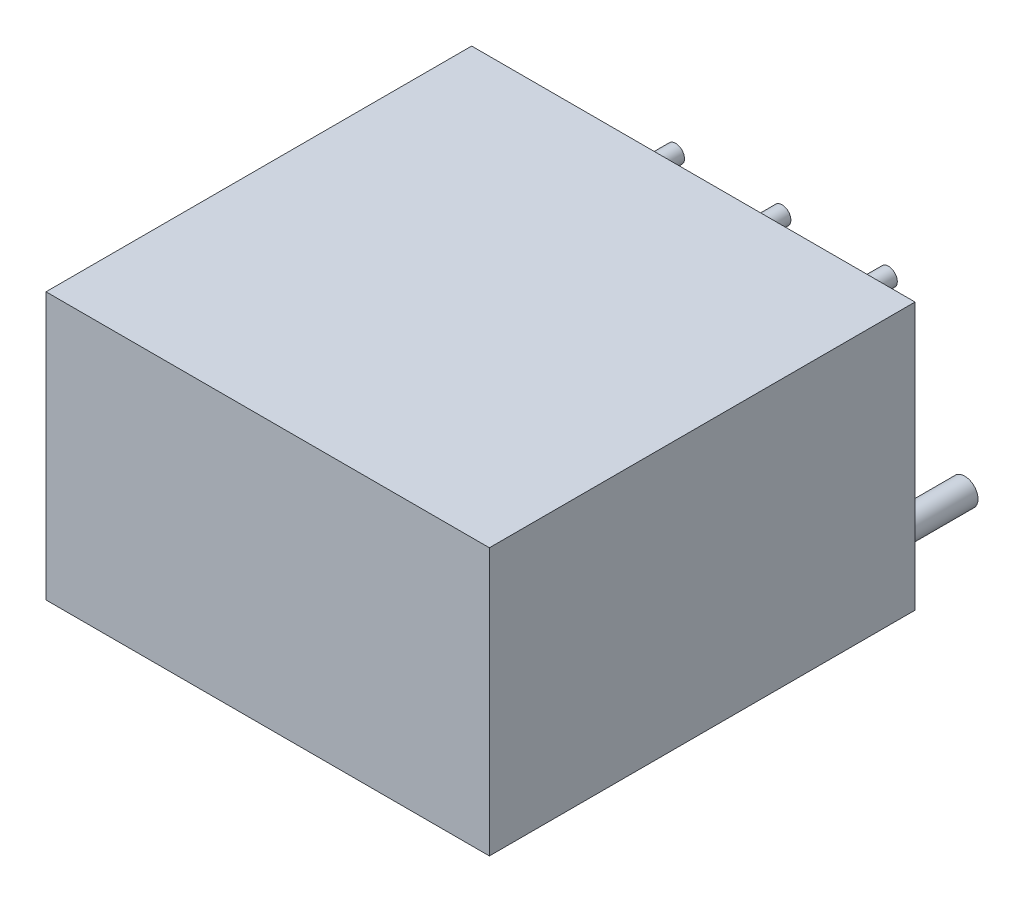
ISO-10303-21;
HEADER;
FILE_DESCRIPTION(('STEP AP214'),'2;1');
FILE_NAME('part.step','',(''),(''),'','','');
FILE_SCHEMA(('AUTOMOTIVE_DESIGN { 1 0 10303 214 1 1 1 1 }'));
ENDSEC;
DATA;
#1=APPLICATION_CONTEXT('core data for automotive mechanical design processes');
#2=APPLICATION_PROTOCOL_DEFINITION('international standard','automotive_design',2000,#1);
#3=PRODUCT_CONTEXT('',#1,'mechanical');
#4=PRODUCT('Part','Part','',(#3));
#5=PRODUCT_RELATED_PRODUCT_CATEGORY('part','',(#4));
#6=PRODUCT_DEFINITION_FORMATION('','',#4);
#7=PRODUCT_DEFINITION_CONTEXT('part definition',#1,'design');
#8=PRODUCT_DEFINITION('design','',#6,#7);
#9=PRODUCT_DEFINITION_SHAPE('','',#8);
#10=(LENGTH_UNIT() NAMED_UNIT(*) SI_UNIT(.MILLI.,.METRE.));
#11=(NAMED_UNIT(*) PLANE_ANGLE_UNIT() SI_UNIT($,.RADIAN.));
#12=(NAMED_UNIT(*) SI_UNIT($,.STERADIAN.) SOLID_ANGLE_UNIT());
#13=UNCERTAINTY_MEASURE_WITH_UNIT(LENGTH_MEASURE(1.E-05),#10,'distance_accuracy_value','');
#14=(GEOMETRIC_REPRESENTATION_CONTEXT(3) GLOBAL_UNCERTAINTY_ASSIGNED_CONTEXT((#13)) GLOBAL_UNIT_ASSIGNED_CONTEXT((#10,
#11,#12)) REPRESENTATION_CONTEXT('',''));
#15=CARTESIAN_POINT('',(0.,0.,0.));
#16=DIRECTION('',(0.,0.,1.));
#17=DIRECTION('',(1.,0.,0.));
#18=AXIS2_PLACEMENT_3D('',#15,#16,#17);
#19=CARTESIAN_POINT('',(-29.5791256800389,10.0182330252573,0.));
#20=DIRECTION('',(0.,0.,1.));
#21=DIRECTION('',(1.,0.,0.));
#22=AXIS2_PLACEMENT_3D('',#19,#20,#21);
#23=PLANE('',#22);
#24=CARTESIAN_POINT('',(-23.0791262800389,14.5682308652573,0.));
#25=DIRECTION('',(0.,0.,1.));
#26=DIRECTION('',(1.,0.,0.));
#27=AXIS2_PLACEMENT_3D('',#24,#25,#26);
#28=CIRCLE('',#27,0.499999999999999);
#29=CARTESIAN_POINT('',(-22.5791262800389,14.5682308652573,0.));
#30=VERTEX_POINT('',#29);
#31=EDGE_CURVE('E42',#30,#30,#28,.F.);
#32=ORIENTED_EDGE('',*,*,#31,.F.);
#33=EDGE_LOOP('',(#32));
#34=FACE_BOUND('',#33,.T.);
#35=CARTESIAN_POINT('',(-17.0791255800389,20.5682308652573,0.));
#36=DIRECTION('',(0.,0.,1.));
#37=DIRECTION('',(1.,0.,0.));
#38=AXIS2_PLACEMENT_3D('',#35,#36,#37);
#39=CIRCLE('',#38,0.499999999999999);
#40=CARTESIAN_POINT('',(-16.5791255800389,20.5682308652573,0.));
#41=VERTEX_POINT('',#40);
#42=EDGE_CURVE('E123',#41,#41,#39,.F.);
#43=ORIENTED_EDGE('',*,*,#42,.F.);
#44=EDGE_LOOP('',(#43));
#45=FACE_BOUND('',#44,.T.);
#46=CARTESIAN_POINT('',(-17.0791255800389,14.5682308652573,0.));
#47=DIRECTION('',(0.,0.,1.));
#48=DIRECTION('',(1.,0.,0.));
#49=AXIS2_PLACEMENT_3D('',#46,#47,#48);
#50=CIRCLE('',#49,0.499999999999999);
#51=CARTESIAN_POINT('',(-16.5791255800389,14.5682308652573,0.));
#52=VERTEX_POINT('',#51);
#53=EDGE_CURVE('E117',#52,#52,#50,.F.);
#54=ORIENTED_EDGE('',*,*,#53,.F.);
#55=EDGE_LOOP('',(#54));
#56=FACE_BOUND('',#55,.T.);
#57=CARTESIAN_POINT('',(-6.77912488003891,12.2182330252573,0.));
#58=DIRECTION('',(0.,0.,1.));
#59=DIRECTION('',(1.,0.,0.));
#60=AXIS2_PLACEMENT_3D('',#57,#58,#59);
#61=CIRCLE('',#60,0.75);
#62=CARTESIAN_POINT('',(-6.02912488003891,12.2182330252573,0.));
#63=VERTEX_POINT('',#62);
#64=EDGE_CURVE('E111',#63,#63,#61,.F.);
#65=ORIENTED_EDGE('',*,*,#64,.F.);
#66=EDGE_LOOP('',(#65));
#67=FACE_BOUND('',#66,.T.);
#68=DIRECTION('',(0.,-1.,0.));
#69=VECTOR('',#68,1.);
#70=CARTESIAN_POINT('',(-29.5791256800389,25.0682308652573,0.));
#71=LINE('',#70,#69);
#72=CARTESIAN_POINT('',(-29.5791256800389,25.0682308652573,0.));
#73=VERTEX_POINT('',#72);
#74=CARTESIAN_POINT('',(-29.5791256800389,10.0182330252573,0.));
#75=VERTEX_POINT('',#74);
#76=EDGE_CURVE('E101',#73,#75,#71,.T.);
#77=ORIENTED_EDGE('',*,*,#76,.F.);
#78=DIRECTION('',(-1.,0.,0.));
#79=VECTOR('',#78,1.);
#80=CARTESIAN_POINT('',(-29.5791256800389,25.0682308652573,0.));
#81=LINE('',#80,#79);
#82=CARTESIAN_POINT('',(-4.57912488003891,25.0682308652573,0.));
#83=VERTEX_POINT('',#82);
#84=EDGE_CURVE('E73',#83,#73,#81,.T.);
#85=ORIENTED_EDGE('',*,*,#84,.F.);
#86=DIRECTION('',(0.,1.,0.));
#87=VECTOR('',#86,1.);
#88=CARTESIAN_POINT('',(-4.57912488003891,25.0682308652573,0.));
#89=LINE('',#88,#87);
#90=CARTESIAN_POINT('',(-4.57912488003891,10.0182330252573,0.));
#91=VERTEX_POINT('',#90);
#92=EDGE_CURVE('E67',#91,#83,#89,.T.);
#93=ORIENTED_EDGE('',*,*,#92,.F.);
#94=DIRECTION('',(1.,0.,0.));
#95=VECTOR('',#94,1.);
#96=CARTESIAN_POINT('',(-29.5791256800389,10.0182330252573,0.));
#97=LINE('',#96,#95);
#98=EDGE_CURVE('E91',#75,#91,#97,.T.);
#99=ORIENTED_EDGE('',*,*,#98,.F.);
#100=EDGE_LOOP('',(#77,#85,#93,#99));
#101=FACE_BOUND('',#100,.T.);
#102=CARTESIAN_POINT('',(-11.0791248800389,14.5682308652573,0.));
#103=DIRECTION('',(0.,0.,1.));
#104=DIRECTION('',(1.,0.,0.));
#105=AXIS2_PLACEMENT_3D('',#102,#103,#104);
#106=CIRCLE('',#105,0.499999999999999);
#107=CARTESIAN_POINT('',(-10.5791248800389,14.5682308652573,0.));
#108=VERTEX_POINT('',#107);
#109=EDGE_CURVE('E114',#108,#108,#106,.F.);
#110=ORIENTED_EDGE('',*,*,#109,.F.);
#111=EDGE_LOOP('',(#110));
#112=FACE_BOUND('',#111,.T.);
#113=CARTESIAN_POINT('',(-11.0791248800389,20.5682308652573,0.));
#114=DIRECTION('',(0.,0.,1.));
#115=DIRECTION('',(1.,0.,0.));
#116=AXIS2_PLACEMENT_3D('',#113,#114,#115);
#117=CIRCLE('',#116,0.499999999999999);
#118=CARTESIAN_POINT('',(-10.5791248800389,20.5682308652573,0.));
#119=VERTEX_POINT('',#118);
#120=EDGE_CURVE('E120',#119,#119,#117,.F.);
#121=ORIENTED_EDGE('',*,*,#120,.F.);
#122=EDGE_LOOP('',(#121));
#123=FACE_BOUND('',#122,.T.);
#124=CARTESIAN_POINT('',(-23.0791262800389,20.5682308652573,0.));
#125=DIRECTION('',(0.,0.,1.));
#126=DIRECTION('',(1.,0.,0.));
#127=AXIS2_PLACEMENT_3D('',#124,#125,#126);
#128=CIRCLE('',#127,0.499999999999999);
#129=CARTESIAN_POINT('',(-22.5791262800389,20.5682308652573,0.));
#130=VERTEX_POINT('',#129);
#131=EDGE_CURVE('E126',#130,#130,#128,.F.);
#132=ORIENTED_EDGE('',*,*,#131,.F.);
#133=EDGE_LOOP('',(#132));
#134=FACE_BOUND('',#133,.T.);
#135=CARTESIAN_POINT('',(-27.3791256800389,12.2182330252573,0.));
#136=DIRECTION('',(0.,0.,1.));
#137=DIRECTION('',(1.,0.,0.));
#138=AXIS2_PLACEMENT_3D('',#135,#136,#137);
#139=CIRCLE('',#138,0.750000000000002);
#140=CARTESIAN_POINT('',(-26.6291256800389,12.2182330252573,0.));
#141=VERTEX_POINT('',#140);
#142=EDGE_CURVE('E11',#141,#141,#139,.F.);
#143=ORIENTED_EDGE('',*,*,#142,.F.);
#144=EDGE_LOOP('',(#143));
#145=FACE_BOUND('',#144,.T.);
#146=ADVANCED_FACE('F33',(#34,#45,#56,#67,#101,#112,#123,#134,#145),#23,.F.);
#147=CARTESIAN_POINT('',(-29.5791256800389,25.0682308652573,24.));
#148=DIRECTION('',(1.,0.,0.));
#149=DIRECTION('',(0.,0.,-1.));
#150=AXIS2_PLACEMENT_3D('',#147,#148,#149);
#151=PLANE('',#150);
#152=ORIENTED_EDGE('',*,*,#76,.T.);
#153=DIRECTION('',(0.,0.,-1.));
#154=VECTOR('',#153,1.);
#155=CARTESIAN_POINT('',(-29.5791256800389,10.0182330252573,24.));
#156=LINE('',#155,#154);
#157=CARTESIAN_POINT('',(-29.5791256800389,10.0182330252573,24.));
#158=VERTEX_POINT('',#157);
#159=EDGE_CURVE('E92',#158,#75,#156,.T.);
#160=ORIENTED_EDGE('',*,*,#159,.F.);
#161=DIRECTION('',(0.,-1.,0.));
#162=VECTOR('',#161,1.);
#163=CARTESIAN_POINT('',(-29.5791256800389,25.0682308652573,24.));
#164=LINE('',#163,#162);
#165=CARTESIAN_POINT('',(-29.5791256800389,25.0682308652573,24.));
#166=VERTEX_POINT('',#165);
#167=EDGE_CURVE('E86',#166,#158,#164,.T.);
#168=ORIENTED_EDGE('',*,*,#167,.F.);
#169=DIRECTION('',(0.,0.,-1.));
#170=VECTOR('',#169,1.);
#171=CARTESIAN_POINT('',(-29.5791256800389,25.0682308652573,24.));
#172=LINE('',#171,#170);
#173=EDGE_CURVE('E97',#166,#73,#172,.T.);
#174=ORIENTED_EDGE('',*,*,#173,.T.);
#175=EDGE_LOOP('',(#152,#160,#168,#174));
#176=FACE_BOUND('',#175,.T.);
#177=ADVANCED_FACE('F35',(#176),#151,.F.);
#178=CARTESIAN_POINT('',(-29.5791256800389,10.0182330252573,24.));
#179=DIRECTION('',(0.,1.,0.));
#180=DIRECTION('',(0.,0.,1.));
#181=AXIS2_PLACEMENT_3D('',#178,#179,#180);
#182=PLANE('',#181);
#183=ORIENTED_EDGE('',*,*,#98,.T.);
#184=DIRECTION('',(0.,0.,-1.));
#185=VECTOR('',#184,1.);
#186=CARTESIAN_POINT('',(-4.57912488003891,10.0182330252573,24.));
#187=LINE('',#186,#185);
#188=CARTESIAN_POINT('',(-4.57912488003891,10.0182330252573,24.));
#189=VERTEX_POINT('',#188);
#190=EDGE_CURVE('E89',#189,#91,#187,.T.);
#191=ORIENTED_EDGE('',*,*,#190,.F.);
#192=DIRECTION('',(1.,0.,0.));
#193=VECTOR('',#192,1.);
#194=CARTESIAN_POINT('',(-29.5791256800389,10.0182330252573,24.));
#195=LINE('',#194,#193);
#196=EDGE_CURVE('E81',#158,#189,#195,.T.);
#197=ORIENTED_EDGE('',*,*,#196,.F.);
#198=ORIENTED_EDGE('',*,*,#159,.T.);
#199=EDGE_LOOP('',(#183,#191,#197,#198));
#200=FACE_BOUND('',#199,.T.);
#201=ADVANCED_FACE('F90',(#200),#182,.F.);
#202=CARTESIAN_POINT('',(-4.57912488003891,25.0682308652573,24.));
#203=DIRECTION('',(-1.,0.,0.));
#204=DIRECTION('',(0.,0.,1.));
#205=AXIS2_PLACEMENT_3D('',#202,#203,#204);
#206=PLANE('',#205);
#207=ORIENTED_EDGE('',*,*,#92,.T.);
#208=DIRECTION('',(0.,0.,-1.));
#209=VECTOR('',#208,1.);
#210=CARTESIAN_POINT('',(-4.57912488003891,25.0682308652573,24.));
#211=LINE('',#210,#209);
#212=CARTESIAN_POINT('',(-4.57912488003891,25.0682308652573,24.));
#213=VERTEX_POINT('',#212);
#214=EDGE_CURVE('E93',#213,#83,#211,.T.);
#215=ORIENTED_EDGE('',*,*,#214,.F.);
#216=DIRECTION('',(0.,1.,0.));
#217=VECTOR('',#216,1.);
#218=CARTESIAN_POINT('',(-4.57912488003891,25.0682308652573,24.));
#219=LINE('',#218,#217);
#220=EDGE_CURVE('E84',#189,#213,#219,.T.);
#221=ORIENTED_EDGE('',*,*,#220,.F.);
#222=ORIENTED_EDGE('',*,*,#190,.T.);
#223=EDGE_LOOP('',(#207,#215,#221,#222));
#224=FACE_BOUND('',#223,.T.);
#225=ADVANCED_FACE('F95',(#224),#206,.F.);
#226=CARTESIAN_POINT('',(-29.5791256800389,25.0682308652573,24.));
#227=DIRECTION('',(0.,-1.,0.));
#228=DIRECTION('',(0.,0.,-1.));
#229=AXIS2_PLACEMENT_3D('',#226,#227,#228);
#230=PLANE('',#229);
#231=ORIENTED_EDGE('',*,*,#84,.T.);
#232=ORIENTED_EDGE('',*,*,#173,.F.);
#233=DIRECTION('',(-1.,0.,0.));
#234=VECTOR('',#233,1.);
#235=CARTESIAN_POINT('',(-29.5791256800389,25.0682308652573,24.));
#236=LINE('',#235,#234);
#237=EDGE_CURVE('E50',#213,#166,#236,.T.);
#238=ORIENTED_EDGE('',*,*,#237,.F.);
#239=ORIENTED_EDGE('',*,*,#214,.T.);
#240=EDGE_LOOP('',(#231,#232,#238,#239));
#241=FACE_BOUND('',#240,.T.);
#242=ADVANCED_FACE('F220',(#241),#230,.F.);
#243=CARTESIAN_POINT('',(-29.5791256800389,10.0182330252573,24.));
#244=DIRECTION('',(0.,0.,1.));
#245=DIRECTION('',(1.,0.,0.));
#246=AXIS2_PLACEMENT_3D('',#243,#244,#245);
#247=PLANE('',#246);
#248=ORIENTED_EDGE('',*,*,#167,.T.);
#249=ORIENTED_EDGE('',*,*,#196,.T.);
#250=ORIENTED_EDGE('',*,*,#220,.T.);
#251=ORIENTED_EDGE('',*,*,#237,.T.);
#252=EDGE_LOOP('',(#248,#249,#250,#251));
#253=FACE_BOUND('',#252,.T.);
#254=ADVANCED_FACE('F82',(#253),#247,.T.);
#255=CARTESIAN_POINT('',(-6.77912488003891,12.2182330252573,-5.));
#256=DIRECTION('',(0.,0.,1.));
#257=DIRECTION('',(1.,0.,0.));
#258=AXIS2_PLACEMENT_3D('',#255,#256,#257);
#259=CYLINDRICAL_SURFACE('',#258,0.75);
#260=CARTESIAN_POINT('',(-6.77912488003891,12.2182330252573,-5.));
#261=DIRECTION('',(0.,0.,-1.));
#262=DIRECTION('',(-1.,0.,0.));
#263=AXIS2_PLACEMENT_3D('',#260,#261,#262);
#264=CIRCLE('',#263,0.75);
#265=CARTESIAN_POINT('',(-7.52912488003891,12.2182330252573,-5.));
#266=VERTEX_POINT('',#265);
#267=EDGE_CURVE('E104',#266,#266,#264,.T.);
#268=ORIENTED_EDGE('',*,*,#267,.F.);
#269=EDGE_LOOP('',(#268));
#270=FACE_BOUND('',#269,.T.);
#271=ORIENTED_EDGE('',*,*,#64,.T.);
#272=EDGE_LOOP('',(#271));
#273=FACE_BOUND('',#272,.T.);
#274=ADVANCED_FACE('F214',(#270,#273),#259,.T.);
#275=CARTESIAN_POINT('',(-6.77912488003891,12.2182330252573,-5.));
#276=DIRECTION('',(0.,0.,-1.));
#277=DIRECTION('',(-1.,0.,0.));
#278=AXIS2_PLACEMENT_3D('',#275,#276,#277);
#279=PLANE('',#278);
#280=ORIENTED_EDGE('',*,*,#267,.T.);
#281=EDGE_LOOP('',(#280));
#282=FACE_BOUND('',#281,.T.);
#283=ADVANCED_FACE('F210',(#282),#279,.T.);
#284=CARTESIAN_POINT('',(-11.0791248800389,14.5682308652573,-5.));
#285=DIRECTION('',(0.,0.,1.));
#286=DIRECTION('',(1.,0.,0.));
#287=AXIS2_PLACEMENT_3D('',#284,#285,#286);
#288=CYLINDRICAL_SURFACE('',#287,0.499999999999999);
#289=CARTESIAN_POINT('',(-11.0791248800389,14.5682308652573,-5.));
#290=DIRECTION('',(0.,0.,-1.));
#291=DIRECTION('',(-1.,0.,0.));
#292=AXIS2_PLACEMENT_3D('',#289,#290,#291);
#293=CIRCLE('',#292,0.499999999999999);
#294=CARTESIAN_POINT('',(-11.5791248800389,14.5682308652573,-5.));
#295=VERTEX_POINT('',#294);
#296=EDGE_CURVE('E235',#295,#295,#293,.T.);
#297=ORIENTED_EDGE('',*,*,#296,.F.);
#298=EDGE_LOOP('',(#297));
#299=FACE_BOUND('',#298,.T.);
#300=ORIENTED_EDGE('',*,*,#109,.T.);
#301=EDGE_LOOP('',(#300));
#302=FACE_BOUND('',#301,.T.);
#303=ADVANCED_FACE('F206',(#299,#302),#288,.T.);
#304=CARTESIAN_POINT('',(-11.0791248800389,14.5682308652573,-5.));
#305=DIRECTION('',(0.,0.,-1.));
#306=DIRECTION('',(-1.,0.,0.));
#307=AXIS2_PLACEMENT_3D('',#304,#305,#306);
#308=PLANE('',#307);
#309=ORIENTED_EDGE('',*,*,#296,.T.);
#310=EDGE_LOOP('',(#309));
#311=FACE_BOUND('',#310,.T.);
#312=ADVANCED_FACE('F202',(#311),#308,.T.);
#313=CARTESIAN_POINT('',(-17.0791255800389,14.5682308652573,-5.));
#314=DIRECTION('',(0.,0.,1.));
#315=DIRECTION('',(1.,0.,0.));
#316=AXIS2_PLACEMENT_3D('',#313,#314,#315);
#317=CYLINDRICAL_SURFACE('',#316,0.499999999999999);
#318=CARTESIAN_POINT('',(-17.0791255800389,14.5682308652573,-5.));
#319=DIRECTION('',(0.,0.,-1.));
#320=DIRECTION('',(-1.,0.,0.));
#321=AXIS2_PLACEMENT_3D('',#318,#319,#320);
#322=CIRCLE('',#321,0.499999999999999);
#323=CARTESIAN_POINT('',(-17.5791255800389,14.5682308652573,-5.));
#324=VERTEX_POINT('',#323);
#325=EDGE_CURVE('E238',#324,#324,#322,.T.);
#326=ORIENTED_EDGE('',*,*,#325,.F.);
#327=EDGE_LOOP('',(#326));
#328=FACE_BOUND('',#327,.T.);
#329=ORIENTED_EDGE('',*,*,#53,.T.);
#330=EDGE_LOOP('',(#329));
#331=FACE_BOUND('',#330,.T.);
#332=ADVANCED_FACE('F198',(#328,#331),#317,.T.);
#333=CARTESIAN_POINT('',(-17.0791255800389,14.5682308652573,-5.));
#334=DIRECTION('',(0.,0.,-1.));
#335=DIRECTION('',(-1.,0.,0.));
#336=AXIS2_PLACEMENT_3D('',#333,#334,#335);
#337=PLANE('',#336);
#338=ORIENTED_EDGE('',*,*,#325,.T.);
#339=EDGE_LOOP('',(#338));
#340=FACE_BOUND('',#339,.T.);
#341=ADVANCED_FACE('F194',(#340),#337,.T.);
#342=CARTESIAN_POINT('',(-11.0791248800389,20.5682308652573,-5.));
#343=DIRECTION('',(0.,0.,1.));
#344=DIRECTION('',(1.,0.,0.));
#345=AXIS2_PLACEMENT_3D('',#342,#343,#344);
#346=CYLINDRICAL_SURFACE('',#345,0.499999999999999);
#347=CARTESIAN_POINT('',(-11.0791248800389,20.5682308652573,-5.));
#348=DIRECTION('',(0.,0.,-1.));
#349=DIRECTION('',(-1.,0.,0.));
#350=AXIS2_PLACEMENT_3D('',#347,#348,#349);
#351=CIRCLE('',#350,0.499999999999999);
#352=CARTESIAN_POINT('',(-11.5791248800389,20.5682308652573,-5.));
#353=VERTEX_POINT('',#352);
#354=EDGE_CURVE('E241',#353,#353,#351,.T.);
#355=ORIENTED_EDGE('',*,*,#354,.F.);
#356=EDGE_LOOP('',(#355));
#357=FACE_BOUND('',#356,.T.);
#358=ORIENTED_EDGE('',*,*,#120,.T.);
#359=EDGE_LOOP('',(#358));
#360=FACE_BOUND('',#359,.T.);
#361=ADVANCED_FACE('F190',(#357,#360),#346,.T.);
#362=CARTESIAN_POINT('',(-11.0791248800389,20.5682308652573,-5.));
#363=DIRECTION('',(0.,0.,-1.));
#364=DIRECTION('',(-1.,0.,0.));
#365=AXIS2_PLACEMENT_3D('',#362,#363,#364);
#366=PLANE('',#365);
#367=ORIENTED_EDGE('',*,*,#354,.T.);
#368=EDGE_LOOP('',(#367));
#369=FACE_BOUND('',#368,.T.);
#370=ADVANCED_FACE('F186',(#369),#366,.T.);
#371=CARTESIAN_POINT('',(-17.0791255800389,20.5682308652573,-5.));
#372=DIRECTION('',(0.,0.,1.));
#373=DIRECTION('',(1.,0.,0.));
#374=AXIS2_PLACEMENT_3D('',#371,#372,#373);
#375=CYLINDRICAL_SURFACE('',#374,0.499999999999999);
#376=CARTESIAN_POINT('',(-17.0791255800389,20.5682308652573,-5.));
#377=DIRECTION('',(0.,0.,-1.));
#378=DIRECTION('',(-1.,0.,0.));
#379=AXIS2_PLACEMENT_3D('',#376,#377,#378);
#380=CIRCLE('',#379,0.499999999999999);
#381=CARTESIAN_POINT('',(-17.5791255800389,20.5682308652573,-5.));
#382=VERTEX_POINT('',#381);
#383=EDGE_CURVE('E244',#382,#382,#380,.T.);
#384=ORIENTED_EDGE('',*,*,#383,.F.);
#385=EDGE_LOOP('',(#384));
#386=FACE_BOUND('',#385,.T.);
#387=ORIENTED_EDGE('',*,*,#42,.T.);
#388=EDGE_LOOP('',(#387));
#389=FACE_BOUND('',#388,.T.);
#390=ADVANCED_FACE('F182',(#386,#389),#375,.T.);
#391=CARTESIAN_POINT('',(-17.0791255800389,20.5682308652573,-5.));
#392=DIRECTION('',(0.,0.,-1.));
#393=DIRECTION('',(-1.,0.,0.));
#394=AXIS2_PLACEMENT_3D('',#391,#392,#393);
#395=PLANE('',#394);
#396=ORIENTED_EDGE('',*,*,#383,.T.);
#397=EDGE_LOOP('',(#396));
#398=FACE_BOUND('',#397,.T.);
#399=ADVANCED_FACE('F178',(#398),#395,.T.);
#400=CARTESIAN_POINT('',(-23.0791262800389,20.5682308652573,-5.));
#401=DIRECTION('',(0.,0.,1.));
#402=DIRECTION('',(1.,0.,0.));
#403=AXIS2_PLACEMENT_3D('',#400,#401,#402);
#404=CYLINDRICAL_SURFACE('',#403,0.499999999999999);
#405=CARTESIAN_POINT('',(-23.0791262800389,20.5682308652573,-5.));
#406=DIRECTION('',(0.,0.,-1.));
#407=DIRECTION('',(-1.,0.,0.));
#408=AXIS2_PLACEMENT_3D('',#405,#406,#407);
#409=CIRCLE('',#408,0.499999999999999);
#410=CARTESIAN_POINT('',(-23.5791262800389,20.5682308652573,-5.));
#411=VERTEX_POINT('',#410);
#412=EDGE_CURVE('E247',#411,#411,#409,.T.);
#413=ORIENTED_EDGE('',*,*,#412,.F.);
#414=EDGE_LOOP('',(#413));
#415=FACE_BOUND('',#414,.T.);
#416=ORIENTED_EDGE('',*,*,#131,.T.);
#417=EDGE_LOOP('',(#416));
#418=FACE_BOUND('',#417,.T.);
#419=ADVANCED_FACE('F174',(#415,#418),#404,.T.);
#420=CARTESIAN_POINT('',(-23.0791262800389,20.5682308652573,-5.));
#421=DIRECTION('',(0.,0.,-1.));
#422=DIRECTION('',(-1.,0.,0.));
#423=AXIS2_PLACEMENT_3D('',#420,#421,#422);
#424=PLANE('',#423);
#425=ORIENTED_EDGE('',*,*,#412,.T.);
#426=EDGE_LOOP('',(#425));
#427=FACE_BOUND('',#426,.T.);
#428=ADVANCED_FACE('F170',(#427),#424,.T.);
#429=CARTESIAN_POINT('',(-23.0791262800389,14.5682308652573,-5.));
#430=DIRECTION('',(0.,0.,1.));
#431=DIRECTION('',(1.,0.,0.));
#432=AXIS2_PLACEMENT_3D('',#429,#430,#431);
#433=CYLINDRICAL_SURFACE('',#432,0.499999999999999);
#434=CARTESIAN_POINT('',(-23.0791262800389,14.5682308652573,-5.));
#435=DIRECTION('',(0.,0.,-1.));
#436=DIRECTION('',(-1.,0.,0.));
#437=AXIS2_PLACEMENT_3D('',#434,#435,#436);
#438=CIRCLE('',#437,0.499999999999999);
#439=CARTESIAN_POINT('',(-23.5791262800389,14.5682308652573,-5.));
#440=VERTEX_POINT('',#439);
#441=EDGE_CURVE('E250',#440,#440,#438,.T.);
#442=ORIENTED_EDGE('',*,*,#441,.F.);
#443=EDGE_LOOP('',(#442));
#444=FACE_BOUND('',#443,.T.);
#445=ORIENTED_EDGE('',*,*,#31,.T.);
#446=EDGE_LOOP('',(#445));
#447=FACE_BOUND('',#446,.T.);
#448=ADVANCED_FACE('F131',(#444,#447),#433,.T.);
#449=CARTESIAN_POINT('',(-23.0791262800389,14.5682308652573,-5.));
#450=DIRECTION('',(0.,0.,-1.));
#451=DIRECTION('',(-1.,0.,0.));
#452=AXIS2_PLACEMENT_3D('',#449,#450,#451);
#453=PLANE('',#452);
#454=ORIENTED_EDGE('',*,*,#441,.T.);
#455=EDGE_LOOP('',(#454));
#456=FACE_BOUND('',#455,.T.);
#457=ADVANCED_FACE('F155',(#456),#453,.T.);
#458=CARTESIAN_POINT('',(-27.3791256800389,12.2182330252573,-5.));
#459=DIRECTION('',(0.,0.,1.));
#460=DIRECTION('',(1.,0.,0.));
#461=AXIS2_PLACEMENT_3D('',#458,#459,#460);
#462=CYLINDRICAL_SURFACE('',#461,0.750000000000002);
#463=CARTESIAN_POINT('',(-27.3791256800389,12.2182330252573,-5.));
#464=DIRECTION('',(0.,0.,-1.));
#465=DIRECTION('',(-1.,0.,0.));
#466=AXIS2_PLACEMENT_3D('',#463,#464,#465);
#467=CIRCLE('',#466,0.750000000000002);
#468=CARTESIAN_POINT('',(-28.1291256800389,12.2182330252573,-5.));
#469=VERTEX_POINT('',#468);
#470=EDGE_CURVE('E253',#469,#469,#467,.T.);
#471=ORIENTED_EDGE('',*,*,#470,.F.);
#472=EDGE_LOOP('',(#471));
#473=FACE_BOUND('',#472,.T.);
#474=ORIENTED_EDGE('',*,*,#142,.T.);
#475=EDGE_LOOP('',(#474));
#476=FACE_BOUND('',#475,.T.);
#477=ADVANCED_FACE('F152',(#473,#476),#462,.T.);
#478=CARTESIAN_POINT('',(-27.3791256800389,12.2182330252573,-5.));
#479=DIRECTION('',(0.,0.,-1.));
#480=DIRECTION('',(-1.,0.,0.));
#481=AXIS2_PLACEMENT_3D('',#478,#479,#480);
#482=PLANE('',#481);
#483=ORIENTED_EDGE('',*,*,#470,.T.);
#484=EDGE_LOOP('',(#483));
#485=FACE_BOUND('',#484,.T.);
#486=ADVANCED_FACE('F154',(#485),#482,.T.);
#487=CLOSED_SHELL('',(#146,#177,#201,#225,#242,#254,#274,#283,#303,#312,#332,#341,#361,#370,
#390,#399,#419,#428,#448,#457,#477,#486));
#488=MANIFOLD_SOLID_BREP('B2',#487);
#489=ADVANCED_BREP_SHAPE_REPRESENTATION('',(#18,#488),#14);
#490=SHAPE_DEFINITION_REPRESENTATION(#9,#489);
ENDSEC;
END-ISO-10303-21;
